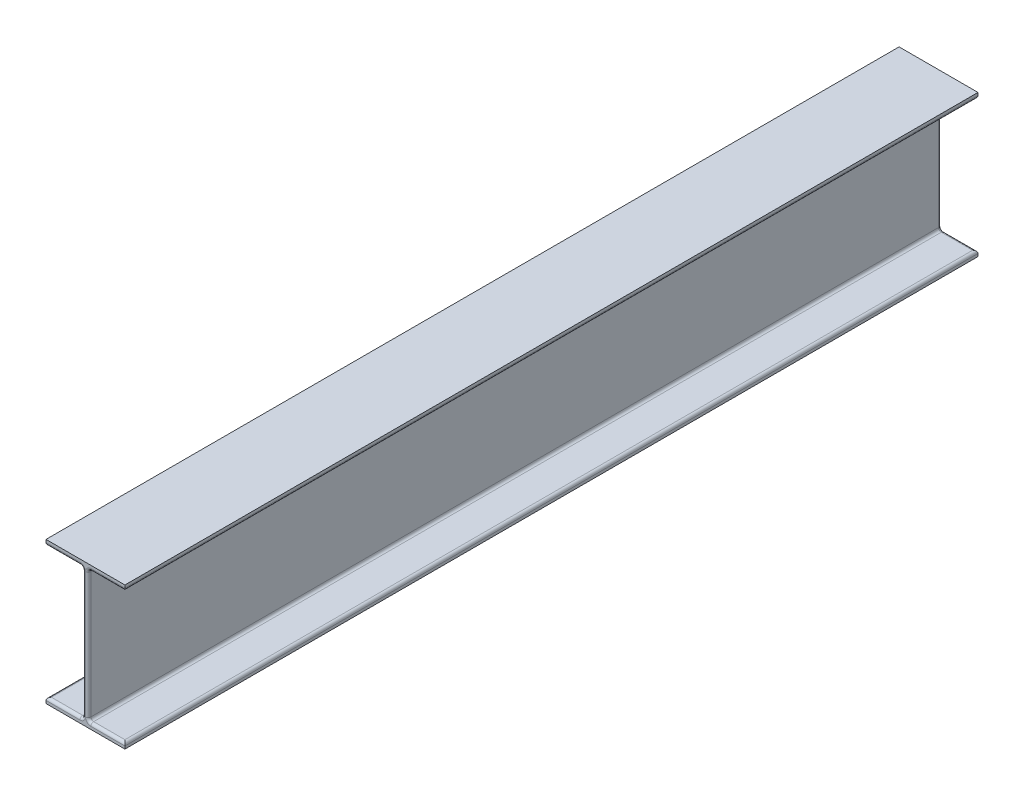
ISO-10303-21;
HEADER;
FILE_DESCRIPTION(('STEP AP214'),'2;1');
FILE_NAME('part.step','',(''),(''),'','','');
FILE_SCHEMA(('AUTOMOTIVE_DESIGN { 1 0 10303 214 1 1 1 1 }'));
ENDSEC;
DATA;
#1=APPLICATION_CONTEXT('core data for automotive mechanical design processes');
#2=APPLICATION_PROTOCOL_DEFINITION('international standard','automotive_design',2000,#1);
#3=PRODUCT_CONTEXT('',#1,'mechanical');
#4=PRODUCT('Part','Part','',(#3));
#5=PRODUCT_RELATED_PRODUCT_CATEGORY('part','',(#4));
#6=PRODUCT_DEFINITION_FORMATION('','',#4);
#7=PRODUCT_DEFINITION_CONTEXT('part definition',#1,'design');
#8=PRODUCT_DEFINITION('design','',#6,#7);
#9=PRODUCT_DEFINITION_SHAPE('','',#8);
#10=(LENGTH_UNIT() NAMED_UNIT(*) SI_UNIT(.MILLI.,.METRE.));
#11=(NAMED_UNIT(*) PLANE_ANGLE_UNIT() SI_UNIT($,.RADIAN.));
#12=(NAMED_UNIT(*) SI_UNIT($,.STERADIAN.) SOLID_ANGLE_UNIT());
#13=UNCERTAINTY_MEASURE_WITH_UNIT(LENGTH_MEASURE(1.E-05),#10,'distance_accuracy_value','');
#14=(GEOMETRIC_REPRESENTATION_CONTEXT(3) GLOBAL_UNCERTAINTY_ASSIGNED_CONTEXT((#13)) GLOBAL_UNIT_ASSIGNED_CONTEXT((#10,
#11,#12)) REPRESENTATION_CONTEXT('',''));
#15=CARTESIAN_POINT('',(0.,0.,0.));
#16=DIRECTION('',(0.,0.,1.));
#17=DIRECTION('',(1.,0.,0.));
#18=AXIS2_PLACEMENT_3D('',#15,#16,#17);
#19=CARTESIAN_POINT('',(42.291,152.4,-457.2));
#20=DIRECTION('',(0.,0.,1.));
#21=DIRECTION('',(1.,0.,0.));
#22=AXIS2_PLACEMENT_3D('',#19,#20,#21);
#23=PLANE('',#22);
#24=CARTESIAN_POINT('',(5.842,8.76300000000001,-457.2));
#25=DIRECTION('',(0.,0.,1.));
#26=DIRECTION('',(1.,0.,0.));
#27=AXIS2_PLACEMENT_3D('',#24,#25,#26);
#28=CIRCLE('',#27,5.842);
#29=CARTESIAN_POINT('',(5.842,2.921,-457.2));
#30=VERTEX_POINT('',#29);
#31=CARTESIAN_POINT('',(0.,8.76300000000001,-457.2));
#32=VERTEX_POINT('',#31);
#33=EDGE_CURVE('E277',#30,#32,#28,.F.);
#34=ORIENTED_EDGE('',*,*,#33,.F.);
#35=DIRECTION('',(-1.,0.,0.));
#36=VECTOR('',#35,1.);
#37=CARTESIAN_POINT('',(42.291,2.92100000000001,-457.2));
#38=LINE('',#37,#36);
#39=CARTESIAN_POINT('',(42.291,2.921,-457.2));
#40=VERTEX_POINT('',#39);
#41=EDGE_CURVE('E285',#30,#40,#38,.F.);
#42=ORIENTED_EDGE('',*,*,#41,.T.);
#43=DIRECTION('',(0.,1.,0.));
#44=VECTOR('',#43,1.);
#45=CARTESIAN_POINT('',(42.291,0.,-457.2));
#46=LINE('',#45,#44);
#47=CARTESIAN_POINT('',(42.291,0.,-457.2));
#48=VERTEX_POINT('',#47);
#49=EDGE_CURVE('E219',#48,#40,#46,.T.);
#50=ORIENTED_EDGE('',*,*,#49,.F.);
#51=DIRECTION('',(1.,0.,0.));
#52=VECTOR('',#51,1.);
#53=CARTESIAN_POINT('',(-42.291,0.,-457.2));
#54=LINE('',#53,#52);
#55=CARTESIAN_POINT('',(-42.291,0.,-457.2));
#56=VERTEX_POINT('',#55);
#57=EDGE_CURVE('E448',#56,#48,#54,.T.);
#58=ORIENTED_EDGE('',*,*,#57,.F.);
#59=DIRECTION('',(0.,-1.,0.));
#60=VECTOR('',#59,1.);
#61=CARTESIAN_POINT('',(-42.291,5.842,-457.2));
#62=LINE('',#61,#60);
#63=CARTESIAN_POINT('',(-42.291,2.921,-457.2));
#64=VERTEX_POINT('',#63);
#65=EDGE_CURVE('E446',#64,#56,#62,.T.);
#66=ORIENTED_EDGE('',*,*,#65,.F.);
#67=DIRECTION('',(-1.,0.,0.));
#68=VECTOR('',#67,1.);
#69=CARTESIAN_POINT('',(42.291,2.92100000000001,-457.2));
#70=LINE('',#69,#68);
#71=CARTESIAN_POINT('',(-5.842,2.921,-457.2));
#72=VERTEX_POINT('',#71);
#73=EDGE_CURVE('E283',#64,#72,#70,.F.);
#74=ORIENTED_EDGE('',*,*,#73,.T.);
#75=CARTESIAN_POINT('',(-5.842,8.76300000000001,-457.2));
#76=DIRECTION('',(0.,0.,1.));
#77=DIRECTION('',(1.,0.,0.));
#78=AXIS2_PLACEMENT_3D('',#75,#76,#77);
#79=CIRCLE('',#78,5.842);
#80=EDGE_CURVE('E280',#32,#72,#79,.F.);
#81=ORIENTED_EDGE('',*,*,#80,.F.);
#82=EDGE_LOOP('',(#34,#42,#50,#58,#66,#74,#81));
#83=FACE_BOUND('',#82,.T.);
#84=ADVANCED_FACE('F35',(#83),#23,.F.);
#85=CARTESIAN_POINT('',(42.291,152.4,457.2));
#86=DIRECTION('',(0.,0.,1.));
#87=DIRECTION('',(1.,0.,0.));
#88=AXIS2_PLACEMENT_3D('',#85,#86,#87);
#89=PLANE('',#88);
#90=CARTESIAN_POINT('',(5.842,143.637,457.2));
#91=DIRECTION('',(0.,0.,1.));
#92=DIRECTION('',(1.,0.,0.));
#93=AXIS2_PLACEMENT_3D('',#90,#91,#92);
#94=CIRCLE('',#93,5.842);
#95=CARTESIAN_POINT('',(5.842,149.479,457.2));
#96=VERTEX_POINT('',#95);
#97=CARTESIAN_POINT('',(0.,143.637,457.2));
#98=VERTEX_POINT('',#97);
#99=EDGE_CURVE('E249',#96,#98,#94,.T.);
#100=ORIENTED_EDGE('',*,*,#99,.F.);
#101=DIRECTION('',(1.,0.,0.));
#102=VECTOR('',#101,1.);
#103=CARTESIAN_POINT('',(42.291,149.479,457.2));
#104=LINE('',#103,#102);
#105=CARTESIAN_POINT('',(42.291,149.479,457.2));
#106=VERTEX_POINT('',#105);
#107=EDGE_CURVE('E216',#96,#106,#104,.T.);
#108=ORIENTED_EDGE('',*,*,#107,.T.);
#109=DIRECTION('',(0.,1.,0.));
#110=VECTOR('',#109,1.);
#111=CARTESIAN_POINT('',(42.291,146.558,457.2));
#112=LINE('',#111,#110);
#113=CARTESIAN_POINT('',(42.291,152.4,457.2));
#114=VERTEX_POINT('',#113);
#115=EDGE_CURVE('E209',#106,#114,#112,.T.);
#116=ORIENTED_EDGE('',*,*,#115,.T.);
#117=DIRECTION('',(-1.,0.,0.));
#118=VECTOR('',#117,1.);
#119=CARTESIAN_POINT('',(42.291,152.4,457.2));
#120=LINE('',#119,#118);
#121=CARTESIAN_POINT('',(-42.291,152.4,457.2));
#122=VERTEX_POINT('',#121);
#123=EDGE_CURVE('E213',#114,#122,#120,.T.);
#124=ORIENTED_EDGE('',*,*,#123,.T.);
#125=DIRECTION('',(0.,-1.,0.));
#126=VECTOR('',#125,1.);
#127=CARTESIAN_POINT('',(-42.291,152.4,457.2));
#128=LINE('',#127,#126);
#129=CARTESIAN_POINT('',(-42.291,149.479,457.2));
#130=VERTEX_POINT('',#129);
#131=EDGE_CURVE('E228',#122,#130,#128,.T.);
#132=ORIENTED_EDGE('',*,*,#131,.T.);
#133=DIRECTION('',(1.,0.,0.));
#134=VECTOR('',#133,1.);
#135=CARTESIAN_POINT('',(-2.921,149.479,457.2));
#136=LINE('',#135,#134);
#137=CARTESIAN_POINT('',(-5.842,149.479,457.2));
#138=VERTEX_POINT('',#137);
#139=EDGE_CURVE('E255',#130,#138,#136,.T.);
#140=ORIENTED_EDGE('',*,*,#139,.T.);
#141=CARTESIAN_POINT('',(-5.842,143.637,457.2));
#142=DIRECTION('',(0.,0.,1.));
#143=DIRECTION('',(1.,0.,0.));
#144=AXIS2_PLACEMENT_3D('',#141,#142,#143);
#145=CIRCLE('',#144,5.842);
#146=EDGE_CURVE('E252',#98,#138,#145,.T.);
#147=ORIENTED_EDGE('',*,*,#146,.F.);
#148=EDGE_LOOP('',(#100,#108,#116,#124,#132,#140,#147));
#149=FACE_BOUND('',#148,.T.);
#150=ADVANCED_FACE('F211',(#149),#89,.T.);
#151=CARTESIAN_POINT('',(42.291,146.558,457.2));
#152=DIRECTION('',(-1.,0.,0.));
#153=DIRECTION('',(0.,-1.,0.));
#154=AXIS2_PLACEMENT_3D('',#151,#152,#153);
#155=PLANE('',#154);
#156=ORIENTED_EDGE('',*,*,#115,.F.);
#157=DIRECTION('',(0.,0.,-1.));
#158=VECTOR('',#157,1.);
#159=CARTESIAN_POINT('',(42.291,149.479,457.2));
#160=LINE('',#159,#158);
#161=CARTESIAN_POINT('',(42.291,149.479,-457.2));
#162=VERTEX_POINT('',#161);
#163=EDGE_CURVE('E11',#106,#162,#160,.T.);
#164=ORIENTED_EDGE('',*,*,#163,.T.);
#165=DIRECTION('',(0.,1.,0.));
#166=VECTOR('',#165,1.);
#167=CARTESIAN_POINT('',(42.291,146.558,-457.2));
#168=LINE('',#167,#166);
#169=CARTESIAN_POINT('',(42.291,152.4,-457.2));
#170=VERTEX_POINT('',#169);
#171=EDGE_CURVE('E232',#162,#170,#168,.T.);
#172=ORIENTED_EDGE('',*,*,#171,.T.);
#173=DIRECTION('',(0.,0.,-1.));
#174=VECTOR('',#173,1.);
#175=CARTESIAN_POINT('',(42.291,152.4,457.2));
#176=LINE('',#175,#174);
#177=EDGE_CURVE('E224',#114,#170,#176,.T.);
#178=ORIENTED_EDGE('',*,*,#177,.F.);
#179=EDGE_LOOP('',(#156,#164,#172,#178));
#180=FACE_BOUND('',#179,.T.);
#181=ADVANCED_FACE('F230',(#180),#155,.F.);
#182=CARTESIAN_POINT('',(42.291,152.4,457.2));
#183=DIRECTION('',(0.,-1.,0.));
#184=DIRECTION('',(0.,0.,-1.));
#185=AXIS2_PLACEMENT_3D('',#182,#183,#184);
#186=PLANE('',#185);
#187=DIRECTION('',(-1.,0.,0.));
#188=VECTOR('',#187,1.);
#189=CARTESIAN_POINT('',(42.291,152.4,-457.2));
#190=LINE('',#189,#188);
#191=CARTESIAN_POINT('',(-42.291,152.4,-457.2));
#192=VERTEX_POINT('',#191);
#193=EDGE_CURVE('E436',#170,#192,#190,.T.);
#194=ORIENTED_EDGE('',*,*,#193,.T.);
#195=DIRECTION('',(0.,0.,-1.));
#196=VECTOR('',#195,1.);
#197=CARTESIAN_POINT('',(-42.291,152.4,457.2));
#198=LINE('',#197,#196);
#199=EDGE_CURVE('E226',#122,#192,#198,.T.);
#200=ORIENTED_EDGE('',*,*,#199,.F.);
#201=ORIENTED_EDGE('',*,*,#123,.F.);
#202=ORIENTED_EDGE('',*,*,#177,.T.);
#203=EDGE_LOOP('',(#194,#200,#201,#202));
#204=FACE_BOUND('',#203,.T.);
#205=ADVANCED_FACE('F223',(#204),#186,.F.);
#206=CARTESIAN_POINT('',(-42.291,152.4,457.2));
#207=DIRECTION('',(1.,0.,0.));
#208=DIRECTION('',(0.,1.,0.));
#209=AXIS2_PLACEMENT_3D('',#206,#207,#208);
#210=PLANE('',#209);
#211=DIRECTION('',(0.,-1.,0.));
#212=VECTOR('',#211,1.);
#213=CARTESIAN_POINT('',(-42.291,152.4,-457.2));
#214=LINE('',#213,#212);
#215=CARTESIAN_POINT('',(-42.291,149.479,-457.2));
#216=VERTEX_POINT('',#215);
#217=EDGE_CURVE('E438',#192,#216,#214,.T.);
#218=ORIENTED_EDGE('',*,*,#217,.T.);
#219=DIRECTION('',(0.,0.,-1.));
#220=VECTOR('',#219,1.);
#221=CARTESIAN_POINT('',(-42.291,149.479,457.2));
#222=LINE('',#221,#220);
#223=EDGE_CURVE('E44',#216,#130,#222,.F.);
#224=ORIENTED_EDGE('',*,*,#223,.T.);
#225=ORIENTED_EDGE('',*,*,#131,.F.);
#226=ORIENTED_EDGE('',*,*,#199,.T.);
#227=EDGE_LOOP('',(#218,#224,#225,#226));
#228=FACE_BOUND('',#227,.T.);
#229=ADVANCED_FACE('F660',(#228),#210,.F.);
#230=CARTESIAN_POINT('',(-42.291,146.558,457.2));
#231=DIRECTION('',(0.,1.,0.));
#232=DIRECTION('',(0.,0.,1.));
#233=AXIS2_PLACEMENT_3D('',#230,#231,#232);
#234=PLANE('',#233);
#235=DIRECTION('',(1.,0.,0.));
#236=VECTOR('',#235,1.);
#237=CARTESIAN_POINT('',(-42.291,146.558,-454.279));
#238=LINE('',#237,#236);
#239=CARTESIAN_POINT('',(-39.37,146.558,-454.279));
#240=VERTEX_POINT('',#239);
#241=CARTESIAN_POINT('',(-5.842,146.558,-454.279));
#242=VERTEX_POINT('',#241);
#243=EDGE_CURVE('E289',#240,#242,#238,.T.);
#244=ORIENTED_EDGE('',*,*,#243,.T.);
#245=DIRECTION('',(0.,0.,-1.));
#246=VECTOR('',#245,1.);
#247=CARTESIAN_POINT('',(-5.842,146.558,457.2));
#248=LINE('',#247,#246);
#249=CARTESIAN_POINT('',(-5.842,146.558,454.279));
#250=VERTEX_POINT('',#249);
#251=EDGE_CURVE('E294',#242,#250,#248,.F.);
#252=ORIENTED_EDGE('',*,*,#251,.T.);
#253=DIRECTION('',(1.,0.,0.));
#254=VECTOR('',#253,1.);
#255=CARTESIAN_POINT('',(-42.291,146.558,454.279));
#256=LINE('',#255,#254);
#257=CARTESIAN_POINT('',(-39.37,146.558,454.279));
#258=VERTEX_POINT('',#257);
#259=EDGE_CURVE('E291',#250,#258,#256,.F.);
#260=ORIENTED_EDGE('',*,*,#259,.T.);
#261=DIRECTION('',(0.,0.,-1.));
#262=VECTOR('',#261,1.);
#263=CARTESIAN_POINT('',(-39.37,146.558,457.2));
#264=LINE('',#263,#262);
#265=EDGE_CURVE('E287',#258,#240,#264,.T.);
#266=ORIENTED_EDGE('',*,*,#265,.T.);
#267=EDGE_LOOP('',(#244,#252,#260,#266));
#268=FACE_BOUND('',#267,.T.);
#269=ADVANCED_FACE('F663',(#268),#234,.F.);
#270=CARTESIAN_POINT('',(-2.921,146.558,457.2));
#271=DIRECTION('',(1.,0.,0.));
#272=DIRECTION('',(0.,0.,-1.));
#273=AXIS2_PLACEMENT_3D('',#270,#271,#272);
#274=PLANE('',#273);
#275=DIRECTION('',(0.,-1.,0.));
#276=VECTOR('',#275,1.);
#277=CARTESIAN_POINT('',(-2.921,146.558,454.279));
#278=LINE('',#277,#276);
#279=CARTESIAN_POINT('',(-2.921,8.76300000000001,454.279));
#280=VERTEX_POINT('',#279);
#281=CARTESIAN_POINT('',(-2.921,143.637,454.279));
#282=VERTEX_POINT('',#281);
#283=EDGE_CURVE('E52',#280,#282,#278,.F.);
#284=ORIENTED_EDGE('',*,*,#283,.T.);
#285=DIRECTION('',(0.,0.,-1.));
#286=VECTOR('',#285,1.);
#287=CARTESIAN_POINT('',(-2.921,143.637,-457.2));
#288=LINE('',#287,#286);
#289=CARTESIAN_POINT('',(-2.921,143.637,-454.279));
#290=VERTEX_POINT('',#289);
#291=EDGE_CURVE('E332',#282,#290,#288,.T.);
#292=ORIENTED_EDGE('',*,*,#291,.T.);
#293=DIRECTION('',(0.,-1.,0.));
#294=VECTOR('',#293,1.);
#295=CARTESIAN_POINT('',(-2.921,146.558,-454.279));
#296=LINE('',#295,#294);
#297=CARTESIAN_POINT('',(-2.921,8.76300000000001,-454.279));
#298=VERTEX_POINT('',#297);
#299=EDGE_CURVE('E328',#290,#298,#296,.T.);
#300=ORIENTED_EDGE('',*,*,#299,.T.);
#301=DIRECTION('',(0.,0.,-1.));
#302=VECTOR('',#301,1.);
#303=CARTESIAN_POINT('',(-2.921,8.76300000000001,457.2));
#304=LINE('',#303,#302);
#305=EDGE_CURVE('E57',#298,#280,#304,.F.);
#306=ORIENTED_EDGE('',*,*,#305,.T.);
#307=EDGE_LOOP('',(#284,#292,#300,#306));
#308=FACE_BOUND('',#307,.T.);
#309=ADVANCED_FACE('F666',(#308),#274,.F.);
#310=CARTESIAN_POINT('',(-2.921,5.842,457.2));
#311=DIRECTION('',(0.,-1.,0.));
#312=DIRECTION('',(1.,0.,0.));
#313=AXIS2_PLACEMENT_3D('',#310,#311,#312);
#314=PLANE('',#313);
#315=DIRECTION('',(0.,0.,-1.));
#316=VECTOR('',#315,1.);
#317=CARTESIAN_POINT('',(-39.37,5.842,457.2));
#318=LINE('',#317,#316);
#319=CARTESIAN_POINT('',(-39.37,5.842,-454.279));
#320=VERTEX_POINT('',#319);
#321=CARTESIAN_POINT('',(-39.37,5.842,454.279));
#322=VERTEX_POINT('',#321);
#323=EDGE_CURVE('E312',#320,#322,#318,.F.);
#324=ORIENTED_EDGE('',*,*,#323,.T.);
#325=DIRECTION('',(-1.,0.,0.));
#326=VECTOR('',#325,1.);
#327=CARTESIAN_POINT('',(-2.921,5.842,454.279));
#328=LINE('',#327,#326);
#329=CARTESIAN_POINT('',(-5.842,5.842,454.279));
#330=VERTEX_POINT('',#329);
#331=EDGE_CURVE('E314',#322,#330,#328,.F.);
#332=ORIENTED_EDGE('',*,*,#331,.T.);
#333=DIRECTION('',(0.,0.,-1.));
#334=VECTOR('',#333,1.);
#335=CARTESIAN_POINT('',(-5.842,5.842,-457.2));
#336=LINE('',#335,#334);
#337=CARTESIAN_POINT('',(-5.842,5.842,-454.279));
#338=VERTEX_POINT('',#337);
#339=EDGE_CURVE('E308',#330,#338,#336,.T.);
#340=ORIENTED_EDGE('',*,*,#339,.T.);
#341=DIRECTION('',(-1.,0.,0.));
#342=VECTOR('',#341,1.);
#343=CARTESIAN_POINT('',(-2.921,5.842,-454.279));
#344=LINE('',#343,#342);
#345=EDGE_CURVE('E310',#338,#320,#344,.T.);
#346=ORIENTED_EDGE('',*,*,#345,.T.);
#347=EDGE_LOOP('',(#324,#332,#340,#346));
#348=FACE_BOUND('',#347,.T.);
#349=ADVANCED_FACE('F670',(#348),#314,.F.);
#350=CARTESIAN_POINT('',(-42.291,5.842,457.2));
#351=DIRECTION('',(1.,0.,0.));
#352=DIRECTION('',(0.,0.,-1.));
#353=AXIS2_PLACEMENT_3D('',#350,#351,#352);
#354=PLANE('',#353);
#355=DIRECTION('',(0.,-1.,0.));
#356=VECTOR('',#355,1.);
#357=CARTESIAN_POINT('',(-42.291,5.842,457.2));
#358=LINE('',#357,#356);
#359=CARTESIAN_POINT('',(-42.291,2.921,457.2));
#360=VERTEX_POINT('',#359);
#361=CARTESIAN_POINT('',(-42.291,0.,457.2));
#362=VERTEX_POINT('',#361);
#363=EDGE_CURVE('E490',#360,#362,#358,.T.);
#364=ORIENTED_EDGE('',*,*,#363,.F.);
#365=DIRECTION('',(0.,0.,-1.));
#366=VECTOR('',#365,1.);
#367=CARTESIAN_POINT('',(-42.291,2.921,457.2));
#368=LINE('',#367,#366);
#369=EDGE_CURVE('E317',#360,#64,#368,.T.);
#370=ORIENTED_EDGE('',*,*,#369,.T.);
#371=ORIENTED_EDGE('',*,*,#65,.T.);
#372=DIRECTION('',(0.,0.,-1.));
#373=VECTOR('',#372,1.);
#374=CARTESIAN_POINT('',(-42.291,0.,457.2));
#375=LINE('',#374,#373);
#376=EDGE_CURVE('E239',#362,#56,#375,.T.);
#377=ORIENTED_EDGE('',*,*,#376,.F.);
#378=EDGE_LOOP('',(#364,#370,#371,#377));
#379=FACE_BOUND('',#378,.T.);
#380=ADVANCED_FACE('F673',(#379),#354,.F.);
#381=CARTESIAN_POINT('',(-42.291,0.,457.2));
#382=DIRECTION('',(0.,1.,0.));
#383=DIRECTION('',(0.,0.,1.));
#384=AXIS2_PLACEMENT_3D('',#381,#382,#383);
#385=PLANE('',#384);
#386=ORIENTED_EDGE('',*,*,#57,.T.);
#387=DIRECTION('',(0.,0.,-1.));
#388=VECTOR('',#387,1.);
#389=CARTESIAN_POINT('',(42.291,0.,457.2));
#390=LINE('',#389,#388);
#391=CARTESIAN_POINT('',(42.291,0.,457.2));
#392=VERTEX_POINT('',#391);
#393=EDGE_CURVE('E452',#392,#48,#390,.T.);
#394=ORIENTED_EDGE('',*,*,#393,.F.);
#395=DIRECTION('',(1.,0.,0.));
#396=VECTOR('',#395,1.);
#397=CARTESIAN_POINT('',(-42.291,0.,457.2));
#398=LINE('',#397,#396);
#399=EDGE_CURVE('E461',#362,#392,#398,.T.);
#400=ORIENTED_EDGE('',*,*,#399,.F.);
#401=ORIENTED_EDGE('',*,*,#376,.T.);
#402=EDGE_LOOP('',(#386,#394,#400,#401));
#403=FACE_BOUND('',#402,.T.);
#404=ADVANCED_FACE('F459',(#403),#385,.F.);
#405=CARTESIAN_POINT('',(42.291,0.,457.2));
#406=DIRECTION('',(-1.,0.,0.));
#407=DIRECTION('',(0.,0.,1.));
#408=AXIS2_PLACEMENT_3D('',#405,#406,#407);
#409=PLANE('',#408);
#410=ORIENTED_EDGE('',*,*,#49,.T.);
#411=DIRECTION('',(0.,0.,-1.));
#412=VECTOR('',#411,1.);
#413=CARTESIAN_POINT('',(42.291,2.921,457.2));
#414=LINE('',#413,#412);
#415=CARTESIAN_POINT('',(42.291,2.92100000000001,457.2));
#416=VERTEX_POINT('',#415);
#417=EDGE_CURVE('E305',#40,#416,#414,.F.);
#418=ORIENTED_EDGE('',*,*,#417,.T.);
#419=DIRECTION('',(0.,1.,0.));
#420=VECTOR('',#419,1.);
#421=CARTESIAN_POINT('',(42.291,0.,457.2));
#422=LINE('',#421,#420);
#423=EDGE_CURVE('E441',#392,#416,#422,.T.);
#424=ORIENTED_EDGE('',*,*,#423,.F.);
#425=ORIENTED_EDGE('',*,*,#393,.T.);
#426=EDGE_LOOP('',(#410,#418,#424,#425));
#427=FACE_BOUND('',#426,.T.);
#428=ADVANCED_FACE('F471',(#427),#409,.F.);
#429=CARTESIAN_POINT('',(42.291,5.842,457.2));
#430=DIRECTION('',(0.,-1.,0.));
#431=DIRECTION('',(1.,0.,0.));
#432=AXIS2_PLACEMENT_3D('',#429,#430,#431);
#433=PLANE('',#432);
#434=DIRECTION('',(-1.,0.,0.));
#435=VECTOR('',#434,1.);
#436=CARTESIAN_POINT('',(42.291,5.842,454.279));
#437=LINE('',#436,#435);
#438=CARTESIAN_POINT('',(5.842,5.842,454.279));
#439=VERTEX_POINT('',#438);
#440=CARTESIAN_POINT('',(39.37,5.842,454.279));
#441=VERTEX_POINT('',#440);
#442=EDGE_CURVE('E300',#439,#441,#437,.F.);
#443=ORIENTED_EDGE('',*,*,#442,.T.);
#444=DIRECTION('',(0.,0.,-1.));
#445=VECTOR('',#444,1.);
#446=CARTESIAN_POINT('',(39.37,5.842,457.2));
#447=LINE('',#446,#445);
#448=CARTESIAN_POINT('',(39.37,5.842,-454.279));
#449=VERTEX_POINT('',#448);
#450=EDGE_CURVE('E302',#441,#449,#447,.T.);
#451=ORIENTED_EDGE('',*,*,#450,.T.);
#452=DIRECTION('',(-1.,0.,0.));
#453=VECTOR('',#452,1.);
#454=CARTESIAN_POINT('',(42.291,5.842,-454.279));
#455=LINE('',#454,#453);
#456=CARTESIAN_POINT('',(5.842,5.842,-454.279));
#457=VERTEX_POINT('',#456);
#458=EDGE_CURVE('E298',#449,#457,#455,.T.);
#459=ORIENTED_EDGE('',*,*,#458,.T.);
#460=DIRECTION('',(0.,0.,-1.));
#461=VECTOR('',#460,1.);
#462=CARTESIAN_POINT('',(5.842,5.842,457.2));
#463=LINE('',#462,#461);
#464=EDGE_CURVE('E296',#457,#439,#463,.F.);
#465=ORIENTED_EDGE('',*,*,#464,.T.);
#466=EDGE_LOOP('',(#443,#451,#459,#465));
#467=FACE_BOUND('',#466,.T.);
#468=ADVANCED_FACE('F570',(#467),#433,.F.);
#469=CARTESIAN_POINT('',(2.921,5.842,457.2));
#470=DIRECTION('',(-1.,0.,0.));
#471=DIRECTION('',(0.,0.,1.));
#472=AXIS2_PLACEMENT_3D('',#469,#470,#471);
#473=PLANE('',#472);
#474=DIRECTION('',(0.,1.,0.));
#475=VECTOR('',#474,1.);
#476=CARTESIAN_POINT('',(2.921,5.84200000000001,454.279));
#477=LINE('',#476,#475);
#478=CARTESIAN_POINT('',(2.921,143.637,454.279));
#479=VERTEX_POINT('',#478);
#480=CARTESIAN_POINT('',(2.921,8.76300000000001,454.279));
#481=VERTEX_POINT('',#480);
#482=EDGE_CURVE('E323',#479,#481,#477,.F.);
#483=ORIENTED_EDGE('',*,*,#482,.T.);
#484=DIRECTION('',(0.,0.,-1.));
#485=VECTOR('',#484,1.);
#486=CARTESIAN_POINT('',(2.921,8.76300000000001,-457.2));
#487=LINE('',#486,#485);
#488=CARTESIAN_POINT('',(2.921,8.76300000000001,-454.279));
#489=VERTEX_POINT('',#488);
#490=EDGE_CURVE('E325',#481,#489,#487,.T.);
#491=ORIENTED_EDGE('',*,*,#490,.T.);
#492=DIRECTION('',(0.,1.,0.));
#493=VECTOR('',#492,1.);
#494=CARTESIAN_POINT('',(2.921,5.842,-454.279));
#495=LINE('',#494,#493);
#496=CARTESIAN_POINT('',(2.921,143.637,-454.279));
#497=VERTEX_POINT('',#496);
#498=EDGE_CURVE('E319',#489,#497,#495,.T.);
#499=ORIENTED_EDGE('',*,*,#498,.T.);
#500=DIRECTION('',(0.,0.,-1.));
#501=VECTOR('',#500,1.);
#502=CARTESIAN_POINT('',(2.921,143.637,457.2));
#503=LINE('',#502,#501);
#504=EDGE_CURVE('E321',#497,#479,#503,.F.);
#505=ORIENTED_EDGE('',*,*,#504,.T.);
#506=EDGE_LOOP('',(#483,#491,#499,#505));
#507=FACE_BOUND('',#506,.T.);
#508=ADVANCED_FACE('F553',(#507),#473,.F.);
#509=CARTESIAN_POINT('',(2.921,146.558,457.2));
#510=DIRECTION('',(0.,1.,0.));
#511=DIRECTION('',(0.,0.,1.));
#512=AXIS2_PLACEMENT_3D('',#509,#510,#511);
#513=PLANE('',#512);
#514=DIRECTION('',(1.,0.,0.));
#515=VECTOR('',#514,1.);
#516=CARTESIAN_POINT('',(2.921,146.558,454.279));
#517=LINE('',#516,#515);
#518=CARTESIAN_POINT('',(39.37,146.558,454.279));
#519=VERTEX_POINT('',#518);
#520=CARTESIAN_POINT('',(5.842,146.558,454.279));
#521=VERTEX_POINT('',#520);
#522=EDGE_CURVE('E262',#519,#521,#517,.F.);
#523=ORIENTED_EDGE('',*,*,#522,.T.);
#524=DIRECTION('',(0.,0.,-1.));
#525=VECTOR('',#524,1.);
#526=CARTESIAN_POINT('',(5.842,146.558,-457.2));
#527=LINE('',#526,#525);
#528=CARTESIAN_POINT('',(5.842,146.558,-454.279));
#529=VERTEX_POINT('',#528);
#530=EDGE_CURVE('E265',#521,#529,#527,.T.);
#531=ORIENTED_EDGE('',*,*,#530,.T.);
#532=DIRECTION('',(1.,0.,0.));
#533=VECTOR('',#532,1.);
#534=CARTESIAN_POINT('',(2.921,146.558,-454.279));
#535=LINE('',#534,#533);
#536=CARTESIAN_POINT('',(39.37,146.558,-454.279));
#537=VERTEX_POINT('',#536);
#538=EDGE_CURVE('E260',#529,#537,#535,.T.);
#539=ORIENTED_EDGE('',*,*,#538,.T.);
#540=DIRECTION('',(0.,0.,-1.));
#541=VECTOR('',#540,1.);
#542=CARTESIAN_POINT('',(39.37,146.558,457.2));
#543=LINE('',#542,#541);
#544=EDGE_CURVE('E258',#537,#519,#543,.F.);
#545=ORIENTED_EDGE('',*,*,#544,.T.);
#546=EDGE_LOOP('',(#523,#531,#539,#545));
#547=FACE_BOUND('',#546,.T.);
#548=ADVANCED_FACE('F562',(#547),#513,.F.);
#549=ORIENTED_EDGE('',*,*,#423,.T.);
#550=DIRECTION('',(-1.,0.,0.));
#551=VECTOR('',#550,1.);
#552=CARTESIAN_POINT('',(2.921,2.92100000000001,457.2));
#553=LINE('',#552,#551);
#554=CARTESIAN_POINT('',(5.842,2.92100000000001,457.2));
#555=VERTEX_POINT('',#554);
#556=EDGE_CURVE('E247',#416,#555,#553,.T.);
#557=ORIENTED_EDGE('',*,*,#556,.T.);
#558=CARTESIAN_POINT('',(5.842,8.76300000000001,457.2));
#559=DIRECTION('',(0.,0.,1.));
#560=DIRECTION('',(1.,0.,0.));
#561=AXIS2_PLACEMENT_3D('',#558,#559,#560);
#562=CIRCLE('',#561,5.842);
#563=CARTESIAN_POINT('',(0.,8.76300000000001,457.2));
#564=VERTEX_POINT('',#563);
#565=EDGE_CURVE('E244',#564,#555,#562,.T.);
#566=ORIENTED_EDGE('',*,*,#565,.F.);
#567=CARTESIAN_POINT('',(-5.842,8.76300000000001,457.2));
#568=DIRECTION('',(0.,0.,1.));
#569=DIRECTION('',(1.,0.,0.));
#570=AXIS2_PLACEMENT_3D('',#567,#568,#569);
#571=CIRCLE('',#570,5.842);
#572=CARTESIAN_POINT('',(-5.842,2.921,457.2));
#573=VERTEX_POINT('',#572);
#574=EDGE_CURVE('E234',#573,#564,#571,.T.);
#575=ORIENTED_EDGE('',*,*,#574,.F.);
#576=DIRECTION('',(-1.,0.,0.));
#577=VECTOR('',#576,1.);
#578=CARTESIAN_POINT('',(-42.291,2.921,457.2));
#579=LINE('',#578,#577);
#580=EDGE_CURVE('E237',#573,#360,#579,.T.);
#581=ORIENTED_EDGE('',*,*,#580,.T.);
#582=ORIENTED_EDGE('',*,*,#363,.T.);
#583=ORIENTED_EDGE('',*,*,#399,.T.);
#584=EDGE_LOOP('',(#549,#557,#566,#575,#581,#582,#583));
#585=FACE_BOUND('',#584,.T.);
#586=ADVANCED_FACE('F489',(#585),#89,.T.);
#587=ORIENTED_EDGE('',*,*,#171,.F.);
#588=DIRECTION('',(1.,0.,0.));
#589=VECTOR('',#588,1.);
#590=CARTESIAN_POINT('',(42.291,149.479,-457.2));
#591=LINE('',#590,#589);
#592=CARTESIAN_POINT('',(5.842,149.479,-457.2));
#593=VERTEX_POINT('',#592);
#594=EDGE_CURVE('E275',#162,#593,#591,.F.);
#595=ORIENTED_EDGE('',*,*,#594,.T.);
#596=CARTESIAN_POINT('',(5.842,143.637,-457.2));
#597=DIRECTION('',(0.,0.,1.));
#598=DIRECTION('',(1.,0.,0.));
#599=AXIS2_PLACEMENT_3D('',#596,#597,#598);
#600=CIRCLE('',#599,5.842);
#601=CARTESIAN_POINT('',(0.,143.637,-457.2));
#602=VERTEX_POINT('',#601);
#603=EDGE_CURVE('E272',#602,#593,#600,.F.);
#604=ORIENTED_EDGE('',*,*,#603,.F.);
#605=CARTESIAN_POINT('',(-5.842,143.637,-457.2));
#606=DIRECTION('',(0.,0.,1.));
#607=DIRECTION('',(1.,0.,0.));
#608=AXIS2_PLACEMENT_3D('',#605,#606,#607);
#609=CIRCLE('',#608,5.842);
#610=CARTESIAN_POINT('',(-5.842,149.479,-457.2));
#611=VERTEX_POINT('',#610);
#612=EDGE_CURVE('E267',#611,#602,#609,.F.);
#613=ORIENTED_EDGE('',*,*,#612,.F.);
#614=DIRECTION('',(1.,0.,0.));
#615=VECTOR('',#614,1.);
#616=CARTESIAN_POINT('',(42.291,149.479,-457.2));
#617=LINE('',#616,#615);
#618=EDGE_CURVE('E270',#611,#216,#617,.F.);
#619=ORIENTED_EDGE('',*,*,#618,.T.);
#620=ORIENTED_EDGE('',*,*,#217,.F.);
#621=ORIENTED_EDGE('',*,*,#193,.F.);
#622=EDGE_LOOP('',(#587,#595,#604,#613,#619,#620,#621));
#623=FACE_BOUND('',#622,.T.);
#624=ADVANCED_FACE('F522',(#623),#23,.F.);
#625=CARTESIAN_POINT('',(-2.921,2.92100000000001,-454.279));
#626=DIRECTION('',(-1.,0.,0.));
#627=DIRECTION('',(0.,-1.,0.));
#628=AXIS2_PLACEMENT_3D('',#625,#626,#627);
#629=CYLINDRICAL_SURFACE('',#628,2.921);
#630=CARTESIAN_POINT('',(-5.842,2.921,-454.279));
#631=DIRECTION('',(1.,0.,0.));
#632=DIRECTION('',(0.,0.,-1.));
#633=AXIS2_PLACEMENT_3D('',#630,#631,#632);
#634=CIRCLE('',#633,2.921);
#635=EDGE_CURVE('E420',#72,#338,#634,.T.);
#636=ORIENTED_EDGE('',*,*,#635,.F.);
#637=ORIENTED_EDGE('',*,*,#73,.F.);
#638=CARTESIAN_POINT('',(-39.37,2.921,-454.279));
#639=DIRECTION('',(-0.707106781186547,0.,0.707106781186547));
#640=DIRECTION('',(-0.707106781186547,0.,-0.707106781186547));
#641=AXIS2_PLACEMENT_3D('',#638,#639,#640);
#642=ELLIPSE('',#641,4.13091781569181,2.921);
#643=EDGE_CURVE('E39',#320,#64,#642,.T.);
#644=ORIENTED_EDGE('',*,*,#643,.F.);
#645=ORIENTED_EDGE('',*,*,#345,.F.);
#646=EDGE_LOOP('',(#636,#637,#644,#645));
#647=FACE_BOUND('',#646,.T.);
#648=ADVANCED_FACE('F578',(#647),#629,.T.);
#649=CARTESIAN_POINT('',(-42.291,149.479,-454.279));
#650=DIRECTION('',(1.,0.,0.));
#651=DIRECTION('',(0.,0.,-1.));
#652=AXIS2_PLACEMENT_3D('',#649,#650,#651);
#653=CYLINDRICAL_SURFACE('',#652,2.921);
#654=CARTESIAN_POINT('',(-5.842,149.479,-454.279));
#655=DIRECTION('',(1.,0.,0.));
#656=DIRECTION('',(0.,0.,-1.));
#657=AXIS2_PLACEMENT_3D('',#654,#655,#656);
#658=CIRCLE('',#657,2.921);
#659=EDGE_CURVE('E423',#242,#611,#658,.T.);
#660=ORIENTED_EDGE('',*,*,#659,.F.);
#661=ORIENTED_EDGE('',*,*,#243,.F.);
#662=CARTESIAN_POINT('',(-39.37,149.479,-454.279));
#663=DIRECTION('',(0.707106781186547,0.,-0.707106781186547));
#664=DIRECTION('',(-0.707106781186547,0.,-0.707106781186547));
#665=AXIS2_PLACEMENT_3D('',#662,#663,#664);
#666=ELLIPSE('',#665,4.13091781569181,2.921);
#667=EDGE_CURVE('E425',#216,#240,#666,.F.);
#668=ORIENTED_EDGE('',*,*,#667,.F.);
#669=ORIENTED_EDGE('',*,*,#618,.F.);
#670=EDGE_LOOP('',(#660,#661,#668,#669));
#671=FACE_BOUND('',#670,.T.);
#672=ADVANCED_FACE('F37',(#671),#653,.T.);
#673=CARTESIAN_POINT('',(-39.37,149.479,457.2));
#674=DIRECTION('',(0.,0.,-1.));
#675=DIRECTION('',(-1.,0.,0.));
#676=AXIS2_PLACEMENT_3D('',#673,#674,#675);
#677=CYLINDRICAL_SURFACE('',#676,2.921);
#678=ORIENTED_EDGE('',*,*,#667,.T.);
#679=ORIENTED_EDGE('',*,*,#265,.F.);
#680=CARTESIAN_POINT('',(-39.37,149.479,454.279));
#681=DIRECTION('',(-0.707106781186547,0.,-0.707106781186547));
#682=DIRECTION('',(0.707106781186547,0.,-0.707106781186547));
#683=AXIS2_PLACEMENT_3D('',#680,#681,#682);
#684=ELLIPSE('',#683,4.13091781569181,2.921);
#685=EDGE_CURVE('E407',#130,#258,#684,.F.);
#686=ORIENTED_EDGE('',*,*,#685,.F.);
#687=ORIENTED_EDGE('',*,*,#223,.F.);
#688=EDGE_LOOP('',(#678,#679,#686,#687));
#689=FACE_BOUND('',#688,.T.);
#690=ADVANCED_FACE('F497',(#689),#677,.T.);
#691=CARTESIAN_POINT('',(-5.842,143.637,-454.279));
#692=DIRECTION('',(0.,0.,1.));
#693=DIRECTION('',(1.,0.,0.));
#694=AXIS2_PLACEMENT_3D('',#691,#692,#693);
#695=TOROIDAL_SURFACE('',#694,5.842,2.921);
#696=CARTESIAN_POINT('',(0.,143.637,-454.279));
#697=DIRECTION('',(0.,1.,0.));
#698=DIRECTION('',(0.,0.,1.));
#699=AXIS2_PLACEMENT_3D('',#696,#697,#698);
#700=CIRCLE('',#699,2.921);
#701=EDGE_CURVE('E404',#290,#602,#700,.F.);
#702=ORIENTED_EDGE('',*,*,#701,.F.);
#703=CARTESIAN_POINT('',(-5.842,143.637,-454.279));
#704=DIRECTION('',(0.,0.,1.));
#705=DIRECTION('',(1.,0.,0.));
#706=AXIS2_PLACEMENT_3D('',#703,#704,#705);
#707=CIRCLE('',#706,2.921);
#708=EDGE_CURVE('E409',#242,#290,#707,.F.);
#709=ORIENTED_EDGE('',*,*,#708,.F.);
#710=ORIENTED_EDGE('',*,*,#659,.T.);
#711=ORIENTED_EDGE('',*,*,#612,.T.);
#712=EDGE_LOOP('',(#702,#709,#710,#711));
#713=FACE_BOUND('',#712,.T.);
#714=ADVANCED_FACE('F536',(#713),#695,.T.);
#715=CARTESIAN_POINT('',(-39.37,2.921,457.2));
#716=DIRECTION('',(0.,0.,-1.));
#717=DIRECTION('',(-1.,0.,0.));
#718=AXIS2_PLACEMENT_3D('',#715,#716,#717);
#719=CYLINDRICAL_SURFACE('',#718,2.921);
#720=ORIENTED_EDGE('',*,*,#643,.T.);
#721=ORIENTED_EDGE('',*,*,#369,.F.);
#722=CARTESIAN_POINT('',(-39.37,2.921,454.279));
#723=DIRECTION('',(-0.707106781186547,0.,-0.707106781186547));
#724=DIRECTION('',(0.707106781186547,0.,-0.707106781186547));
#725=AXIS2_PLACEMENT_3D('',#722,#723,#724);
#726=ELLIPSE('',#725,4.13091781569181,2.921);
#727=EDGE_CURVE('E415',#322,#360,#726,.F.);
#728=ORIENTED_EDGE('',*,*,#727,.F.);
#729=ORIENTED_EDGE('',*,*,#323,.F.);
#730=EDGE_LOOP('',(#720,#721,#728,#729));
#731=FACE_BOUND('',#730,.T.);
#732=ADVANCED_FACE('F589',(#731),#719,.T.);
#733=CARTESIAN_POINT('',(-5.842,8.76300000000001,-454.279));
#734=DIRECTION('',(0.,0.,1.));
#735=DIRECTION('',(1.,0.,0.));
#736=AXIS2_PLACEMENT_3D('',#733,#734,#735);
#737=TOROIDAL_SURFACE('',#736,5.842,2.921);
#738=ORIENTED_EDGE('',*,*,#80,.T.);
#739=ORIENTED_EDGE('',*,*,#635,.T.);
#740=CARTESIAN_POINT('',(-5.842,8.76300000000001,-454.279));
#741=DIRECTION('',(0.,0.,1.));
#742=DIRECTION('',(1.,0.,0.));
#743=AXIS2_PLACEMENT_3D('',#740,#741,#742);
#744=CIRCLE('',#743,2.921);
#745=EDGE_CURVE('E412',#298,#338,#744,.F.);
#746=ORIENTED_EDGE('',*,*,#745,.F.);
#747=CARTESIAN_POINT('',(0.,8.76300000000001,-454.279));
#748=DIRECTION('',(0.,-1.,0.));
#749=DIRECTION('',(0.,0.,-1.));
#750=AXIS2_PLACEMENT_3D('',#747,#748,#749);
#751=CIRCLE('',#750,2.921);
#752=EDGE_CURVE('E401',#32,#298,#751,.F.);
#753=ORIENTED_EDGE('',*,*,#752,.F.);
#754=EDGE_LOOP('',(#738,#739,#746,#753));
#755=FACE_BOUND('',#754,.T.);
#756=ADVANCED_FACE('F592',(#755),#737,.T.);
#757=CARTESIAN_POINT('',(42.291,2.921,-454.279));
#758=DIRECTION('',(-1.,0.,0.));
#759=DIRECTION('',(0.,-1.,0.));
#760=AXIS2_PLACEMENT_3D('',#757,#758,#759);
#761=CYLINDRICAL_SURFACE('',#760,2.921);
#762=CARTESIAN_POINT('',(5.842,2.92100000000001,-454.279));
#763=DIRECTION('',(-1.,0.,0.));
#764=DIRECTION('',(0.,0.,1.));
#765=AXIS2_PLACEMENT_3D('',#762,#763,#764);
#766=CIRCLE('',#765,2.921);
#767=EDGE_CURVE('E398',#457,#30,#766,.T.);
#768=ORIENTED_EDGE('',*,*,#767,.F.);
#769=ORIENTED_EDGE('',*,*,#458,.F.);
#770=CARTESIAN_POINT('',(39.37,2.921,-454.279));
#771=DIRECTION('',(-0.707106781186547,0.,-0.707106781186547));
#772=DIRECTION('',(-0.707106781186547,0.,0.707106781186547));
#773=AXIS2_PLACEMENT_3D('',#770,#771,#772);
#774=ELLIPSE('',#773,4.13091781569181,2.921);
#775=EDGE_CURVE('E418',#40,#449,#774,.F.);
#776=ORIENTED_EDGE('',*,*,#775,.F.);
#777=ORIENTED_EDGE('',*,*,#41,.F.);
#778=EDGE_LOOP('',(#768,#769,#776,#777));
#779=FACE_BOUND('',#778,.T.);
#780=ADVANCED_FACE('F478',(#779),#761,.T.);
#781=CARTESIAN_POINT('',(39.37,2.921,457.2));
#782=DIRECTION('',(0.,0.,-1.));
#783=DIRECTION('',(-1.,0.,0.));
#784=AXIS2_PLACEMENT_3D('',#781,#782,#783);
#785=CYLINDRICAL_SURFACE('',#784,2.921);
#786=ORIENTED_EDGE('',*,*,#775,.T.);
#787=ORIENTED_EDGE('',*,*,#450,.F.);
#788=CARTESIAN_POINT('',(39.37,2.921,454.279));
#789=DIRECTION('',(0.707106781186547,0.,-0.707106781186547));
#790=DIRECTION('',(0.707106781186547,0.,0.707106781186547));
#791=AXIS2_PLACEMENT_3D('',#788,#789,#790);
#792=ELLIPSE('',#791,4.13091781569181,2.921);
#793=EDGE_CURVE('E392',#416,#441,#792,.F.);
#794=ORIENTED_EDGE('',*,*,#793,.F.);
#795=ORIENTED_EDGE('',*,*,#417,.F.);
#796=EDGE_LOOP('',(#786,#787,#794,#795));
#797=FACE_BOUND('',#796,.T.);
#798=ADVANCED_FACE('F482',(#797),#785,.T.);
#799=CARTESIAN_POINT('',(42.291,2.92100000000001,454.279));
#800=DIRECTION('',(1.,0.,0.));
#801=DIRECTION('',(0.,1.,0.));
#802=AXIS2_PLACEMENT_3D('',#799,#800,#801);
#803=CYLINDRICAL_SURFACE('',#802,2.921);
#804=ORIENTED_EDGE('',*,*,#727,.T.);
#805=ORIENTED_EDGE('',*,*,#580,.F.);
#806=CARTESIAN_POINT('',(-5.842,2.92100000000001,454.279));
#807=DIRECTION('',(1.,0.,0.));
#808=DIRECTION('',(0.,0.,-1.));
#809=AXIS2_PLACEMENT_3D('',#806,#807,#808);
#810=CIRCLE('',#809,2.921);
#811=EDGE_CURVE('E389',#330,#573,#810,.T.);
#812=ORIENTED_EDGE('',*,*,#811,.F.);
#813=ORIENTED_EDGE('',*,*,#331,.F.);
#814=EDGE_LOOP('',(#804,#805,#812,#813));
#815=FACE_BOUND('',#814,.T.);
#816=ADVANCED_FACE('F604',(#815),#803,.T.);
#817=CARTESIAN_POINT('',(-5.842,8.76300000000001,457.2));
#818=DIRECTION('',(0.,0.,1.));
#819=DIRECTION('',(1.,0.,0.));
#820=AXIS2_PLACEMENT_3D('',#817,#818,#819);
#821=CYLINDRICAL_SURFACE('',#820,2.921);
#822=ORIENTED_EDGE('',*,*,#745,.T.);
#823=ORIENTED_EDGE('',*,*,#339,.F.);
#824=CARTESIAN_POINT('',(-5.842,8.76300000000001,454.279));
#825=DIRECTION('',(0.,0.,1.));
#826=DIRECTION('',(1.,0.,0.));
#827=AXIS2_PLACEMENT_3D('',#824,#825,#826);
#828=CIRCLE('',#827,2.921);
#829=EDGE_CURVE('E387',#280,#330,#828,.F.);
#830=ORIENTED_EDGE('',*,*,#829,.F.);
#831=ORIENTED_EDGE('',*,*,#305,.F.);
#832=EDGE_LOOP('',(#822,#823,#830,#831));
#833=FACE_BOUND('',#832,.T.);
#834=ADVANCED_FACE('F607',(#833),#821,.F.);
#835=CARTESIAN_POINT('',(-5.842,143.637,457.2));
#836=DIRECTION('',(0.,0.,1.));
#837=DIRECTION('',(1.,0.,0.));
#838=AXIS2_PLACEMENT_3D('',#835,#836,#837);
#839=CYLINDRICAL_SURFACE('',#838,2.921);
#840=ORIENTED_EDGE('',*,*,#708,.T.);
#841=ORIENTED_EDGE('',*,*,#291,.F.);
#842=CARTESIAN_POINT('',(-5.842,143.637,454.279));
#843=DIRECTION('',(0.,0.,1.));
#844=DIRECTION('',(1.,0.,0.));
#845=AXIS2_PLACEMENT_3D('',#842,#843,#844);
#846=CIRCLE('',#845,2.921);
#847=EDGE_CURVE('E384',#250,#282,#846,.F.);
#848=ORIENTED_EDGE('',*,*,#847,.F.);
#849=ORIENTED_EDGE('',*,*,#251,.F.);
#850=EDGE_LOOP('',(#840,#841,#848,#849));
#851=FACE_BOUND('',#850,.T.);
#852=ADVANCED_FACE('F611',(#851),#839,.F.);
#853=CARTESIAN_POINT('',(42.291,149.479,454.279));
#854=DIRECTION('',(-1.,0.,0.));
#855=DIRECTION('',(0.,0.,1.));
#856=AXIS2_PLACEMENT_3D('',#853,#854,#855);
#857=CYLINDRICAL_SURFACE('',#856,2.921);
#858=ORIENTED_EDGE('',*,*,#685,.T.);
#859=ORIENTED_EDGE('',*,*,#259,.F.);
#860=CARTESIAN_POINT('',(-5.842,149.479,454.279));
#861=DIRECTION('',(1.,0.,0.));
#862=DIRECTION('',(0.,0.,-1.));
#863=AXIS2_PLACEMENT_3D('',#860,#861,#862);
#864=CIRCLE('',#863,2.921);
#865=EDGE_CURVE('E381',#138,#250,#864,.T.);
#866=ORIENTED_EDGE('',*,*,#865,.F.);
#867=ORIENTED_EDGE('',*,*,#139,.F.);
#868=EDGE_LOOP('',(#858,#859,#866,#867));
#869=FACE_BOUND('',#868,.T.);
#870=ADVANCED_FACE('F500',(#869),#857,.T.);
#871=CARTESIAN_POINT('',(0.,146.558,-454.279));
#872=DIRECTION('',(0.,-1.,0.));
#873=DIRECTION('',(0.,0.,-1.));
#874=AXIS2_PLACEMENT_3D('',#871,#872,#873);
#875=CYLINDRICAL_SURFACE('',#874,2.921);
#876=ORIENTED_EDGE('',*,*,#299,.F.);
#877=ORIENTED_EDGE('',*,*,#701,.T.);
#878=DIRECTION('',(0.,-1.,0.));
#879=VECTOR('',#878,1.);
#880=CARTESIAN_POINT('',(0.,152.4,-457.2));
#881=LINE('',#880,#879);
#882=EDGE_CURVE('E378',#32,#602,#881,.F.);
#883=ORIENTED_EDGE('',*,*,#882,.F.);
#884=ORIENTED_EDGE('',*,*,#752,.T.);
#885=EDGE_LOOP('',(#876,#877,#883,#884));
#886=FACE_BOUND('',#885,.T.);
#887=ADVANCED_FACE('F541',(#886),#875,.T.);
#888=CARTESIAN_POINT('',(5.842,8.76300000000001,-454.279));
#889=DIRECTION('',(0.,0.,1.));
#890=DIRECTION('',(1.,0.,0.));
#891=AXIS2_PLACEMENT_3D('',#888,#889,#890);
#892=TOROIDAL_SURFACE('',#891,5.842,2.921);
#893=CARTESIAN_POINT('',(0.,8.76300000000001,-454.279));
#894=DIRECTION('',(0.,-1.,0.));
#895=DIRECTION('',(0.,0.,-1.));
#896=AXIS2_PLACEMENT_3D('',#893,#894,#895);
#897=CIRCLE('',#896,2.921);
#898=EDGE_CURVE('E375',#489,#32,#897,.F.);
#899=ORIENTED_EDGE('',*,*,#898,.F.);
#900=CARTESIAN_POINT('',(5.842,8.76300000000001,-454.279));
#901=DIRECTION('',(0.,0.,1.));
#902=DIRECTION('',(1.,0.,0.));
#903=AXIS2_PLACEMENT_3D('',#900,#901,#902);
#904=CIRCLE('',#903,2.921);
#905=EDGE_CURVE('E395',#457,#489,#904,.F.);
#906=ORIENTED_EDGE('',*,*,#905,.F.);
#907=ORIENTED_EDGE('',*,*,#767,.T.);
#908=ORIENTED_EDGE('',*,*,#33,.T.);
#909=EDGE_LOOP('',(#899,#906,#907,#908));
#910=FACE_BOUND('',#909,.T.);
#911=ADVANCED_FACE('F547',(#910),#892,.T.);
#912=CARTESIAN_POINT('',(5.842,8.76300000000001,457.2));
#913=DIRECTION('',(0.,0.,1.));
#914=DIRECTION('',(1.,0.,0.));
#915=AXIS2_PLACEMENT_3D('',#912,#913,#914);
#916=CYLINDRICAL_SURFACE('',#915,2.921);
#917=ORIENTED_EDGE('',*,*,#905,.T.);
#918=ORIENTED_EDGE('',*,*,#490,.F.);
#919=CARTESIAN_POINT('',(5.842,8.76300000000001,454.279));
#920=DIRECTION('',(0.,0.,1.));
#921=DIRECTION('',(1.,0.,0.));
#922=AXIS2_PLACEMENT_3D('',#919,#920,#921);
#923=CIRCLE('',#922,2.921);
#924=EDGE_CURVE('E372',#439,#481,#923,.F.);
#925=ORIENTED_EDGE('',*,*,#924,.F.);
#926=ORIENTED_EDGE('',*,*,#464,.F.);
#927=EDGE_LOOP('',(#917,#918,#925,#926));
#928=FACE_BOUND('',#927,.T.);
#929=ADVANCED_FACE('F551',(#928),#916,.F.);
#930=CARTESIAN_POINT('',(42.291,2.92100000000001,454.279));
#931=DIRECTION('',(1.,0.,0.));
#932=DIRECTION('',(0.,1.,0.));
#933=AXIS2_PLACEMENT_3D('',#930,#931,#932);
#934=CYLINDRICAL_SURFACE('',#933,2.921);
#935=ORIENTED_EDGE('',*,*,#793,.T.);
#936=ORIENTED_EDGE('',*,*,#442,.F.);
#937=CARTESIAN_POINT('',(5.842,2.92100000000001,454.279));
#938=DIRECTION('',(-1.,0.,0.));
#939=DIRECTION('',(0.,0.,1.));
#940=AXIS2_PLACEMENT_3D('',#937,#938,#939);
#941=CIRCLE('',#940,2.921);
#942=EDGE_CURVE('E369',#555,#439,#941,.T.);
#943=ORIENTED_EDGE('',*,*,#942,.F.);
#944=ORIENTED_EDGE('',*,*,#556,.F.);
#945=EDGE_LOOP('',(#935,#936,#943,#944));
#946=FACE_BOUND('',#945,.T.);
#947=ADVANCED_FACE('F485',(#946),#934,.T.);
#948=CARTESIAN_POINT('',(-5.842,8.76300000000001,454.279));
#949=DIRECTION('',(0.,0.,1.));
#950=DIRECTION('',(1.,0.,0.));
#951=AXIS2_PLACEMENT_3D('',#948,#949,#950);
#952=TOROIDAL_SURFACE('',#951,5.842,2.921);
#953=ORIENTED_EDGE('',*,*,#811,.T.);
#954=ORIENTED_EDGE('',*,*,#574,.T.);
#955=CARTESIAN_POINT('',(0.,8.76300000000001,454.279));
#956=DIRECTION('',(0.,-1.,0.));
#957=DIRECTION('',(0.,0.,-1.));
#958=AXIS2_PLACEMENT_3D('',#955,#956,#957);
#959=CIRCLE('',#958,2.921);
#960=EDGE_CURVE('E366',#280,#564,#959,.F.);
#961=ORIENTED_EDGE('',*,*,#960,.F.);
#962=ORIENTED_EDGE('',*,*,#829,.T.);
#963=EDGE_LOOP('',(#953,#954,#961,#962));
#964=FACE_BOUND('',#963,.T.);
#965=ADVANCED_FACE('F626',(#964),#952,.T.);
#966=CARTESIAN_POINT('',(-5.842,143.637,454.279));
#967=DIRECTION('',(0.,0.,1.));
#968=DIRECTION('',(1.,0.,0.));
#969=AXIS2_PLACEMENT_3D('',#966,#967,#968);
#970=TOROIDAL_SURFACE('',#969,5.842,2.921);
#971=ORIENTED_EDGE('',*,*,#865,.T.);
#972=ORIENTED_EDGE('',*,*,#847,.T.);
#973=CARTESIAN_POINT('',(0.,143.637,454.279));
#974=DIRECTION('',(0.,1.,0.));
#975=DIRECTION('',(0.,0.,1.));
#976=AXIS2_PLACEMENT_3D('',#973,#974,#975);
#977=CIRCLE('',#976,2.921);
#978=EDGE_CURVE('E363',#98,#282,#977,.F.);
#979=ORIENTED_EDGE('',*,*,#978,.F.);
#980=ORIENTED_EDGE('',*,*,#146,.T.);
#981=EDGE_LOOP('',(#971,#972,#979,#980));
#982=FACE_BOUND('',#981,.T.);
#983=ADVANCED_FACE('F504',(#982),#970,.T.);
#984=CARTESIAN_POINT('',(0.,5.842,-454.279));
#985=DIRECTION('',(0.,1.,0.));
#986=DIRECTION('',(0.,0.,1.));
#987=AXIS2_PLACEMENT_3D('',#984,#985,#986);
#988=CYLINDRICAL_SURFACE('',#987,2.921);
#989=ORIENTED_EDGE('',*,*,#898,.T.);
#990=ORIENTED_EDGE('',*,*,#882,.T.);
#991=CARTESIAN_POINT('',(0.,143.637,-454.279));
#992=DIRECTION('',(0.,1.,0.));
#993=DIRECTION('',(0.,0.,1.));
#994=AXIS2_PLACEMENT_3D('',#991,#992,#993);
#995=CIRCLE('',#994,2.921);
#996=EDGE_CURVE('E360',#497,#602,#995,.T.);
#997=ORIENTED_EDGE('',*,*,#996,.F.);
#998=ORIENTED_EDGE('',*,*,#498,.F.);
#999=EDGE_LOOP('',(#989,#990,#997,#998));
#1000=FACE_BOUND('',#999,.T.);
#1001=ADVANCED_FACE('F543',(#1000),#988,.T.);
#1002=CARTESIAN_POINT('',(5.842,8.76300000000001,454.279));
#1003=DIRECTION('',(0.,0.,1.));
#1004=DIRECTION('',(1.,0.,0.));
#1005=AXIS2_PLACEMENT_3D('',#1002,#1003,#1004);
#1006=TOROIDAL_SURFACE('',#1005,5.842,2.921);
#1007=ORIENTED_EDGE('',*,*,#942,.T.);
#1008=ORIENTED_EDGE('',*,*,#924,.T.);
#1009=CARTESIAN_POINT('',(0.,8.76300000000001,454.279));
#1010=DIRECTION('',(0.,-1.,0.));
#1011=DIRECTION('',(0.,0.,-1.));
#1012=AXIS2_PLACEMENT_3D('',#1009,#1010,#1011);
#1013=CIRCLE('',#1012,2.921);
#1014=EDGE_CURVE('E354',#564,#481,#1013,.F.);
#1015=ORIENTED_EDGE('',*,*,#1014,.F.);
#1016=ORIENTED_EDGE('',*,*,#565,.T.);
#1017=EDGE_LOOP('',(#1007,#1008,#1015,#1016));
#1018=FACE_BOUND('',#1017,.T.);
#1019=ADVANCED_FACE('F634',(#1018),#1006,.T.);
#1020=CARTESIAN_POINT('',(0.,152.4,454.279));
#1021=DIRECTION('',(0.,1.,0.));
#1022=DIRECTION('',(0.,0.,1.));
#1023=AXIS2_PLACEMENT_3D('',#1020,#1021,#1022);
#1024=CYLINDRICAL_SURFACE('',#1023,2.921);
#1025=ORIENTED_EDGE('',*,*,#283,.F.);
#1026=ORIENTED_EDGE('',*,*,#960,.T.);
#1027=DIRECTION('',(0.,-1.,0.));
#1028=VECTOR('',#1027,1.);
#1029=CARTESIAN_POINT('',(0.,5.84200000000001,457.2));
#1030=LINE('',#1029,#1028);
#1031=EDGE_CURVE('E351',#98,#564,#1030,.T.);
#1032=ORIENTED_EDGE('',*,*,#1031,.F.);
#1033=ORIENTED_EDGE('',*,*,#978,.T.);
#1034=EDGE_LOOP('',(#1025,#1026,#1032,#1033));
#1035=FACE_BOUND('',#1034,.T.);
#1036=ADVANCED_FACE('F637',(#1035),#1024,.T.);
#1037=CARTESIAN_POINT('',(5.842,143.637,-454.279));
#1038=DIRECTION('',(0.,0.,1.));
#1039=DIRECTION('',(1.,0.,0.));
#1040=AXIS2_PLACEMENT_3D('',#1037,#1038,#1039);
#1041=TOROIDAL_SURFACE('',#1040,5.842,2.921);
#1042=CARTESIAN_POINT('',(5.842,149.479,-454.279));
#1043=DIRECTION('',(-1.,0.,0.));
#1044=DIRECTION('',(0.,0.,1.));
#1045=AXIS2_PLACEMENT_3D('',#1042,#1043,#1044);
#1046=CIRCLE('',#1045,2.921);
#1047=EDGE_CURVE('E348',#529,#593,#1046,.F.);
#1048=ORIENTED_EDGE('',*,*,#1047,.F.);
#1049=CARTESIAN_POINT('',(5.842,143.637,-454.279));
#1050=DIRECTION('',(0.,0.,1.));
#1051=DIRECTION('',(1.,0.,0.));
#1052=AXIS2_PLACEMENT_3D('',#1049,#1050,#1051);
#1053=CIRCLE('',#1052,2.921);
#1054=EDGE_CURVE('E357',#497,#529,#1053,.F.);
#1055=ORIENTED_EDGE('',*,*,#1054,.F.);
#1056=ORIENTED_EDGE('',*,*,#996,.T.);
#1057=ORIENTED_EDGE('',*,*,#603,.T.);
#1058=EDGE_LOOP('',(#1048,#1055,#1056,#1057));
#1059=FACE_BOUND('',#1058,.T.);
#1060=ADVANCED_FACE('F530',(#1059),#1041,.T.);
#1061=CARTESIAN_POINT('',(5.842,143.637,457.2));
#1062=DIRECTION('',(0.,0.,1.));
#1063=DIRECTION('',(1.,0.,0.));
#1064=AXIS2_PLACEMENT_3D('',#1061,#1062,#1063);
#1065=CYLINDRICAL_SURFACE('',#1064,2.921);
#1066=ORIENTED_EDGE('',*,*,#1054,.T.);
#1067=ORIENTED_EDGE('',*,*,#530,.F.);
#1068=CARTESIAN_POINT('',(5.842,143.637,454.279));
#1069=DIRECTION('',(0.,0.,1.));
#1070=DIRECTION('',(1.,0.,0.));
#1071=AXIS2_PLACEMENT_3D('',#1068,#1069,#1070);
#1072=CIRCLE('',#1071,2.921);
#1073=EDGE_CURVE('E345',#479,#521,#1072,.F.);
#1074=ORIENTED_EDGE('',*,*,#1073,.F.);
#1075=ORIENTED_EDGE('',*,*,#504,.F.);
#1076=EDGE_LOOP('',(#1066,#1067,#1074,#1075));
#1077=FACE_BOUND('',#1076,.T.);
#1078=ADVANCED_FACE('F560',(#1077),#1065,.F.);
#1079=CARTESIAN_POINT('',(0.,152.4,454.279));
#1080=DIRECTION('',(0.,-1.,0.));
#1081=DIRECTION('',(0.,0.,-1.));
#1082=AXIS2_PLACEMENT_3D('',#1079,#1080,#1081);
#1083=CYLINDRICAL_SURFACE('',#1082,2.921);
#1084=ORIENTED_EDGE('',*,*,#1014,.T.);
#1085=ORIENTED_EDGE('',*,*,#482,.F.);
#1086=CARTESIAN_POINT('',(0.,143.637,454.279));
#1087=DIRECTION('',(0.,1.,0.));
#1088=DIRECTION('',(0.,0.,1.));
#1089=AXIS2_PLACEMENT_3D('',#1086,#1087,#1088);
#1090=CIRCLE('',#1089,2.921);
#1091=EDGE_CURVE('E342',#98,#479,#1090,.T.);
#1092=ORIENTED_EDGE('',*,*,#1091,.F.);
#1093=ORIENTED_EDGE('',*,*,#1031,.T.);
#1094=EDGE_LOOP('',(#1084,#1085,#1092,#1093));
#1095=FACE_BOUND('',#1094,.T.);
#1096=ADVANCED_FACE('F557',(#1095),#1083,.T.);
#1097=CARTESIAN_POINT('',(2.921,149.479,-454.279));
#1098=DIRECTION('',(1.,0.,0.));
#1099=DIRECTION('',(0.,0.,-1.));
#1100=AXIS2_PLACEMENT_3D('',#1097,#1098,#1099);
#1101=CYLINDRICAL_SURFACE('',#1100,2.921);
#1102=ORIENTED_EDGE('',*,*,#1047,.T.);
#1103=ORIENTED_EDGE('',*,*,#594,.F.);
#1104=CARTESIAN_POINT('',(39.37,149.479,-454.279));
#1105=DIRECTION('',(-0.707106781186547,0.,-0.707106781186547));
#1106=DIRECTION('',(0.707106781186547,0.,-0.707106781186547));
#1107=AXIS2_PLACEMENT_3D('',#1104,#1105,#1106);
#1108=ELLIPSE('',#1107,4.13091781569181,2.921);
#1109=EDGE_CURVE('E339',#537,#162,#1108,.F.);
#1110=ORIENTED_EDGE('',*,*,#1109,.F.);
#1111=ORIENTED_EDGE('',*,*,#538,.F.);
#1112=EDGE_LOOP('',(#1102,#1103,#1110,#1111));
#1113=FACE_BOUND('',#1112,.T.);
#1114=ADVANCED_FACE('F525',(#1113),#1101,.T.);
#1115=CARTESIAN_POINT('',(5.842,143.637,454.279));
#1116=DIRECTION('',(0.,0.,1.));
#1117=DIRECTION('',(1.,0.,0.));
#1118=AXIS2_PLACEMENT_3D('',#1115,#1116,#1117);
#1119=TOROIDAL_SURFACE('',#1118,5.842,2.921);
#1120=ORIENTED_EDGE('',*,*,#1091,.T.);
#1121=ORIENTED_EDGE('',*,*,#1073,.T.);
#1122=CARTESIAN_POINT('',(5.842,149.479,454.279));
#1123=DIRECTION('',(-1.,0.,0.));
#1124=DIRECTION('',(0.,0.,1.));
#1125=AXIS2_PLACEMENT_3D('',#1122,#1123,#1124);
#1126=CIRCLE('',#1125,2.921);
#1127=EDGE_CURVE('E337',#96,#521,#1126,.F.);
#1128=ORIENTED_EDGE('',*,*,#1127,.F.);
#1129=ORIENTED_EDGE('',*,*,#99,.T.);
#1130=EDGE_LOOP('',(#1120,#1121,#1128,#1129));
#1131=FACE_BOUND('',#1130,.T.);
#1132=ADVANCED_FACE('F508',(#1131),#1119,.T.);
#1133=CARTESIAN_POINT('',(39.37,149.479,457.2));
#1134=DIRECTION('',(0.,0.,-1.));
#1135=DIRECTION('',(-1.,0.,0.));
#1136=AXIS2_PLACEMENT_3D('',#1133,#1134,#1135);
#1137=CYLINDRICAL_SURFACE('',#1136,2.921);
#1138=ORIENTED_EDGE('',*,*,#1109,.T.);
#1139=ORIENTED_EDGE('',*,*,#163,.F.);
#1140=CARTESIAN_POINT('',(39.37,149.479,454.279));
#1141=DIRECTION('',(0.707106781186547,0.,-0.707106781186547));
#1142=DIRECTION('',(-0.707106781186547,0.,-0.707106781186547));
#1143=AXIS2_PLACEMENT_3D('',#1140,#1141,#1142);
#1144=ELLIPSE('',#1143,4.13091781569181,2.921);
#1145=EDGE_CURVE('E335',#519,#106,#1144,.F.);
#1146=ORIENTED_EDGE('',*,*,#1145,.F.);
#1147=ORIENTED_EDGE('',*,*,#544,.F.);
#1148=EDGE_LOOP('',(#1138,#1139,#1146,#1147));
#1149=FACE_BOUND('',#1148,.T.);
#1150=ADVANCED_FACE('F518',(#1149),#1137,.T.);
#1151=CARTESIAN_POINT('',(42.291,149.479,454.279));
#1152=DIRECTION('',(-1.,0.,0.));
#1153=DIRECTION('',(0.,0.,1.));
#1154=AXIS2_PLACEMENT_3D('',#1151,#1152,#1153);
#1155=CYLINDRICAL_SURFACE('',#1154,2.921);
#1156=ORIENTED_EDGE('',*,*,#1127,.T.);
#1157=ORIENTED_EDGE('',*,*,#522,.F.);
#1158=ORIENTED_EDGE('',*,*,#1145,.T.);
#1159=ORIENTED_EDGE('',*,*,#107,.F.);
#1160=EDGE_LOOP('',(#1156,#1157,#1158,#1159));
#1161=FACE_BOUND('',#1160,.T.);
#1162=ADVANCED_FACE('F513',(#1161),#1155,.T.);
#1163=CLOSED_SHELL('',(#84,#150,#181,#205,#229,#269,#309,#349,#380,#404,#428,#468,#508,#548,
#586,#624,#648,#672,#690,#714,#732,#756,#780,#798,#816,#834,#852,#870,#887,#911,#929,#947,#965,
#983,#1001,#1019,#1036,#1060,#1078,#1096,#1114,#1132,#1150,#1162));
#1164=MANIFOLD_SOLID_BREP('B2',#1163);
#1165=ADVANCED_BREP_SHAPE_REPRESENTATION('',(#18,#1164),#14);
#1166=SHAPE_DEFINITION_REPRESENTATION(#9,#1165);
ENDSEC;
END-ISO-10303-21;
